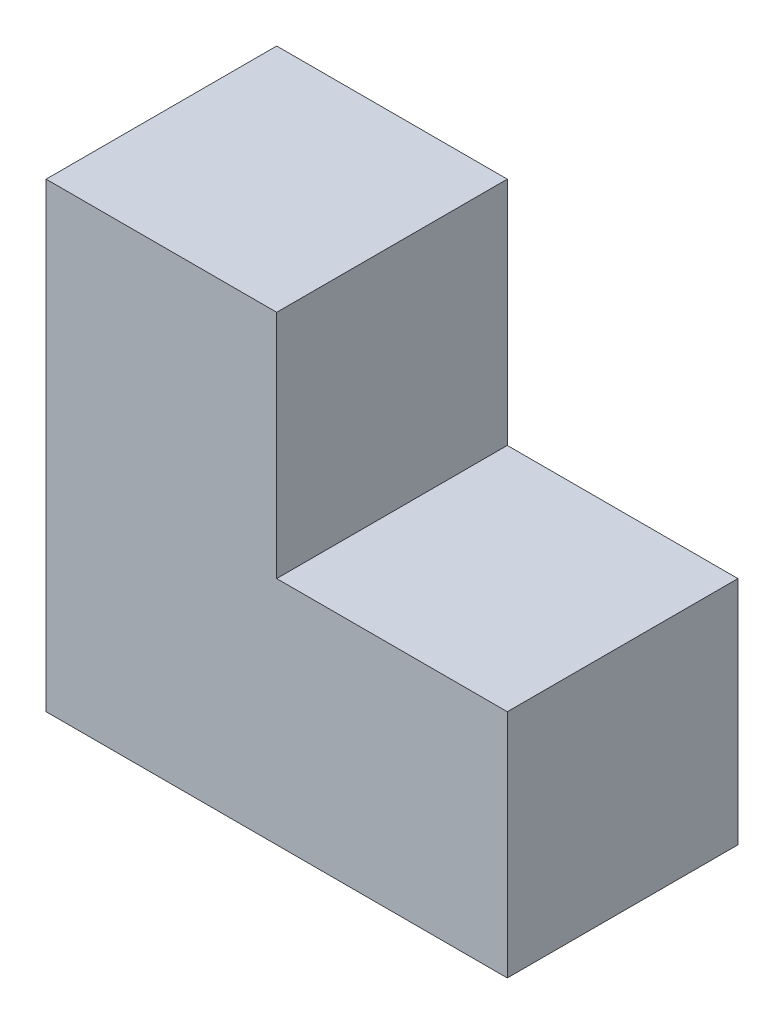
ISO-10303-21;
HEADER;
FILE_DESCRIPTION(('STEP AP214'),'2;1');
FILE_NAME('part.step','',(''),(''),'','','');
FILE_SCHEMA(('AUTOMOTIVE_DESIGN { 1 0 10303 214 1 1 1 1 }'));
ENDSEC;
DATA;
#1=APPLICATION_CONTEXT('core data for automotive mechanical design processes');
#2=APPLICATION_PROTOCOL_DEFINITION('international standard','automotive_design',2000,#1);
#3=PRODUCT_CONTEXT('',#1,'mechanical');
#4=PRODUCT('Part','Part','',(#3));
#5=PRODUCT_RELATED_PRODUCT_CATEGORY('part','',(#4));
#6=PRODUCT_DEFINITION_FORMATION('','',#4);
#7=PRODUCT_DEFINITION_CONTEXT('part definition',#1,'design');
#8=PRODUCT_DEFINITION('design','',#6,#7);
#9=PRODUCT_DEFINITION_SHAPE('','',#8);
#10=(LENGTH_UNIT() NAMED_UNIT(*) SI_UNIT(.MILLI.,.METRE.));
#11=(NAMED_UNIT(*) PLANE_ANGLE_UNIT() SI_UNIT($,.RADIAN.));
#12=(NAMED_UNIT(*) SI_UNIT($,.STERADIAN.) SOLID_ANGLE_UNIT());
#13=UNCERTAINTY_MEASURE_WITH_UNIT(LENGTH_MEASURE(1.E-05),#10,'distance_accuracy_value','');
#14=(GEOMETRIC_REPRESENTATION_CONTEXT(3) GLOBAL_UNCERTAINTY_ASSIGNED_CONTEXT((#13)) GLOBAL_UNIT_ASSIGNED_CONTEXT((#10,
#11,#12)) REPRESENTATION_CONTEXT('',''));
#15=CARTESIAN_POINT('',(0.,0.,0.));
#16=DIRECTION('',(0.,0.,1.));
#17=DIRECTION('',(1.,0.,0.));
#18=AXIS2_PLACEMENT_3D('',#15,#16,#17);
#19=CARTESIAN_POINT('',(600.,0.,300.));
#20=DIRECTION('',(0.,1.,0.));
#21=DIRECTION('',(-1.,0.,0.));
#22=AXIS2_PLACEMENT_3D('',#19,#20,#21);
#23=PLANE('',#22);
#24=DIRECTION('',(1.,0.,0.));
#25=VECTOR('',#24,1.);
#26=CARTESIAN_POINT('',(600.,0.,0.));
#27=LINE('',#26,#25);
#28=CARTESIAN_POINT('',(0.,0.,0.));
#29=VERTEX_POINT('',#28);
#30=CARTESIAN_POINT('',(600.,0.,0.));
#31=VERTEX_POINT('',#30);
#32=EDGE_CURVE('E128',#29,#31,#27,.T.);
#33=ORIENTED_EDGE('',*,*,#32,.T.);
#34=DIRECTION('',(0.,0.,-1.));
#35=VECTOR('',#34,1.);
#36=CARTESIAN_POINT('',(600.,0.,300.));
#37=LINE('',#36,#35);
#38=CARTESIAN_POINT('',(600.,0.,300.));
#39=VERTEX_POINT('',#38);
#40=EDGE_CURVE('E11',#39,#31,#37,.T.);
#41=ORIENTED_EDGE('',*,*,#40,.F.);
#42=DIRECTION('',(1.,0.,0.));
#43=VECTOR('',#42,1.);
#44=CARTESIAN_POINT('',(600.,0.,300.));
#45=LINE('',#44,#43);
#46=CARTESIAN_POINT('',(0.,0.,300.));
#47=VERTEX_POINT('',#46);
#48=EDGE_CURVE('E144',#47,#39,#45,.T.);
#49=ORIENTED_EDGE('',*,*,#48,.F.);
#50=DIRECTION('',(0.,0.,-1.));
#51=VECTOR('',#50,1.);
#52=CARTESIAN_POINT('',(0.,0.,300.));
#53=LINE('',#52,#51);
#54=EDGE_CURVE('E124',#47,#29,#53,.T.);
#55=ORIENTED_EDGE('',*,*,#54,.T.);
#56=EDGE_LOOP('',(#33,#41,#49,#55));
#57=FACE_BOUND('',#56,.T.);
#58=ADVANCED_FACE('F39',(#57),#23,.F.);
#59=CARTESIAN_POINT('',(600.,300.,300.));
#60=DIRECTION('',(-1.,0.,0.));
#61=DIRECTION('',(0.,0.,1.));
#62=AXIS2_PLACEMENT_3D('',#59,#60,#61);
#63=PLANE('',#62);
#64=DIRECTION('',(0.,1.,0.));
#65=VECTOR('',#64,1.);
#66=CARTESIAN_POINT('',(600.,300.,0.));
#67=LINE('',#66,#65);
#68=CARTESIAN_POINT('',(600.,300.,0.));
#69=VERTEX_POINT('',#68);
#70=EDGE_CURVE('E132',#31,#69,#67,.T.);
#71=ORIENTED_EDGE('',*,*,#70,.T.);
#72=DIRECTION('',(0.,0.,-1.));
#73=VECTOR('',#72,1.);
#74=CARTESIAN_POINT('',(600.,300.,300.));
#75=LINE('',#74,#73);
#76=CARTESIAN_POINT('',(600.,300.,300.));
#77=VERTEX_POINT('',#76);
#78=EDGE_CURVE('E48',#77,#69,#75,.T.);
#79=ORIENTED_EDGE('',*,*,#78,.F.);
#80=DIRECTION('',(0.,1.,0.));
#81=VECTOR('',#80,1.);
#82=CARTESIAN_POINT('',(600.,300.,300.));
#83=LINE('',#82,#81);
#84=EDGE_CURVE('E93',#39,#77,#83,.T.);
#85=ORIENTED_EDGE('',*,*,#84,.F.);
#86=ORIENTED_EDGE('',*,*,#40,.T.);
#87=EDGE_LOOP('',(#71,#79,#85,#86));
#88=FACE_BOUND('',#87,.T.);
#89=ADVANCED_FACE('F172',(#88),#63,.F.);
#90=CARTESIAN_POINT('',(300.,300.,300.));
#91=DIRECTION('',(0.,-1.,0.));
#92=DIRECTION('',(0.,0.,-1.));
#93=AXIS2_PLACEMENT_3D('',#90,#91,#92);
#94=PLANE('',#93);
#95=DIRECTION('',(-1.,0.,0.));
#96=VECTOR('',#95,1.);
#97=CARTESIAN_POINT('',(300.,300.,0.));
#98=LINE('',#97,#96);
#99=CARTESIAN_POINT('',(300.,300.,0.));
#100=VERTEX_POINT('',#99);
#101=EDGE_CURVE('E135',#69,#100,#98,.T.);
#102=ORIENTED_EDGE('',*,*,#101,.T.);
#103=DIRECTION('',(0.,0.,-1.));
#104=VECTOR('',#103,1.);
#105=CARTESIAN_POINT('',(300.,300.,300.));
#106=LINE('',#105,#104);
#107=CARTESIAN_POINT('',(300.,300.,300.));
#108=VERTEX_POINT('',#107);
#109=EDGE_CURVE('E117',#108,#100,#106,.T.);
#110=ORIENTED_EDGE('',*,*,#109,.F.);
#111=DIRECTION('',(-1.,0.,0.));
#112=VECTOR('',#111,1.);
#113=CARTESIAN_POINT('',(300.,300.,300.));
#114=LINE('',#113,#112);
#115=EDGE_CURVE('E106',#77,#108,#114,.T.);
#116=ORIENTED_EDGE('',*,*,#115,.F.);
#117=ORIENTED_EDGE('',*,*,#78,.T.);
#118=EDGE_LOOP('',(#102,#110,#116,#117));
#119=FACE_BOUND('',#118,.T.);
#120=ADVANCED_FACE('F154',(#119),#94,.F.);
#121=CARTESIAN_POINT('',(300.,600.,300.));
#122=DIRECTION('',(-1.,0.,0.));
#123=DIRECTION('',(0.,0.,1.));
#124=AXIS2_PLACEMENT_3D('',#121,#122,#123);
#125=PLANE('',#124);
#126=DIRECTION('',(0.,1.,0.));
#127=VECTOR('',#126,1.);
#128=CARTESIAN_POINT('',(300.,600.,0.));
#129=LINE('',#128,#127);
#130=CARTESIAN_POINT('',(300.,600.,0.));
#131=VERTEX_POINT('',#130);
#132=EDGE_CURVE('E115',#100,#131,#129,.T.);
#133=ORIENTED_EDGE('',*,*,#132,.T.);
#134=DIRECTION('',(0.,0.,-1.));
#135=VECTOR('',#134,1.);
#136=CARTESIAN_POINT('',(300.,600.,300.));
#137=LINE('',#136,#135);
#138=CARTESIAN_POINT('',(300.,600.,300.));
#139=VERTEX_POINT('',#138);
#140=EDGE_CURVE('E112',#139,#131,#137,.T.);
#141=ORIENTED_EDGE('',*,*,#140,.F.);
#142=DIRECTION('',(0.,1.,0.));
#143=VECTOR('',#142,1.);
#144=CARTESIAN_POINT('',(300.,600.,300.));
#145=LINE('',#144,#143);
#146=EDGE_CURVE('E100',#108,#139,#145,.T.);
#147=ORIENTED_EDGE('',*,*,#146,.F.);
#148=ORIENTED_EDGE('',*,*,#109,.T.);
#149=EDGE_LOOP('',(#133,#141,#147,#148));
#150=FACE_BOUND('',#149,.T.);
#151=ADVANCED_FACE('F113',(#150),#125,.F.);
#152=CARTESIAN_POINT('',(0.,600.,300.));
#153=DIRECTION('',(0.,-1.,0.));
#154=DIRECTION('',(0.,0.,-1.));
#155=AXIS2_PLACEMENT_3D('',#152,#153,#154);
#156=PLANE('',#155);
#157=DIRECTION('',(-1.,0.,0.));
#158=VECTOR('',#157,1.);
#159=CARTESIAN_POINT('',(0.,600.,0.));
#160=LINE('',#159,#158);
#161=CARTESIAN_POINT('',(0.,600.,0.));
#162=VERTEX_POINT('',#161);
#163=EDGE_CURVE('E79',#131,#162,#160,.T.);
#164=ORIENTED_EDGE('',*,*,#163,.T.);
#165=DIRECTION('',(0.,0.,-1.));
#166=VECTOR('',#165,1.);
#167=CARTESIAN_POINT('',(0.,600.,300.));
#168=LINE('',#167,#166);
#169=CARTESIAN_POINT('',(0.,600.,300.));
#170=VERTEX_POINT('',#169);
#171=EDGE_CURVE('E118',#170,#162,#168,.T.);
#172=ORIENTED_EDGE('',*,*,#171,.F.);
#173=DIRECTION('',(-1.,0.,0.));
#174=VECTOR('',#173,1.);
#175=CARTESIAN_POINT('',(0.,600.,300.));
#176=LINE('',#175,#174);
#177=EDGE_CURVE('E104',#139,#170,#176,.T.);
#178=ORIENTED_EDGE('',*,*,#177,.F.);
#179=ORIENTED_EDGE('',*,*,#140,.T.);
#180=EDGE_LOOP('',(#164,#172,#178,#179));
#181=FACE_BOUND('',#180,.T.);
#182=ADVANCED_FACE('F120',(#181),#156,.F.);
#183=CARTESIAN_POINT('',(0.,0.,300.));
#184=DIRECTION('',(1.,0.,0.));
#185=DIRECTION('',(0.,0.,-1.));
#186=AXIS2_PLACEMENT_3D('',#183,#184,#185);
#187=PLANE('',#186);
#188=DIRECTION('',(0.,-1.,0.));
#189=VECTOR('',#188,1.);
#190=CARTESIAN_POINT('',(0.,0.,0.));
#191=LINE('',#190,#189);
#192=EDGE_CURVE('E85',#162,#29,#191,.T.);
#193=ORIENTED_EDGE('',*,*,#192,.T.);
#194=ORIENTED_EDGE('',*,*,#54,.F.);
#195=DIRECTION('',(0.,-1.,0.));
#196=VECTOR('',#195,1.);
#197=CARTESIAN_POINT('',(0.,0.,300.));
#198=LINE('',#197,#196);
#199=EDGE_CURVE('E56',#170,#47,#198,.T.);
#200=ORIENTED_EDGE('',*,*,#199,.F.);
#201=ORIENTED_EDGE('',*,*,#171,.T.);
#202=EDGE_LOOP('',(#193,#194,#200,#201));
#203=FACE_BOUND('',#202,.T.);
#204=ADVANCED_FACE('F161',(#203),#187,.F.);
#205=CARTESIAN_POINT('',(0.,0.,300.));
#206=DIRECTION('',(0.,0.,-1.));
#207=DIRECTION('',(-1.,0.,0.));
#208=AXIS2_PLACEMENT_3D('',#205,#206,#207);
#209=PLANE('',#208);
#210=ORIENTED_EDGE('',*,*,#48,.T.);
#211=ORIENTED_EDGE('',*,*,#84,.T.);
#212=ORIENTED_EDGE('',*,*,#115,.T.);
#213=ORIENTED_EDGE('',*,*,#146,.T.);
#214=ORIENTED_EDGE('',*,*,#177,.T.);
#215=ORIENTED_EDGE('',*,*,#199,.T.);
#216=EDGE_LOOP('',(#210,#211,#212,#213,#214,#215));
#217=FACE_BOUND('',#216,.T.);
#218=ADVANCED_FACE('F102',(#217),#209,.F.);
#219=CARTESIAN_POINT('',(0.,0.,0.));
#220=DIRECTION('',(0.,0.,-1.));
#221=DIRECTION('',(-1.,0.,0.));
#222=AXIS2_PLACEMENT_3D('',#219,#220,#221);
#223=PLANE('',#222);
#224=ORIENTED_EDGE('',*,*,#32,.F.);
#225=ORIENTED_EDGE('',*,*,#192,.F.);
#226=ORIENTED_EDGE('',*,*,#163,.F.);
#227=ORIENTED_EDGE('',*,*,#132,.F.);
#228=ORIENTED_EDGE('',*,*,#101,.F.);
#229=ORIENTED_EDGE('',*,*,#70,.F.);
#230=EDGE_LOOP('',(#224,#225,#226,#227,#228,#229));
#231=FACE_BOUND('',#230,.T.);
#232=ADVANCED_FACE('F157',(#231),#223,.T.);
#233=CLOSED_SHELL('',(#58,#89,#120,#151,#182,#204,#218,#232));
#234=MANIFOLD_SOLID_BREP('B2',#233);
#235=ADVANCED_BREP_SHAPE_REPRESENTATION('',(#18,#234),#14);
#236=SHAPE_DEFINITION_REPRESENTATION(#9,#235);
ENDSEC;
END-ISO-10303-21;
